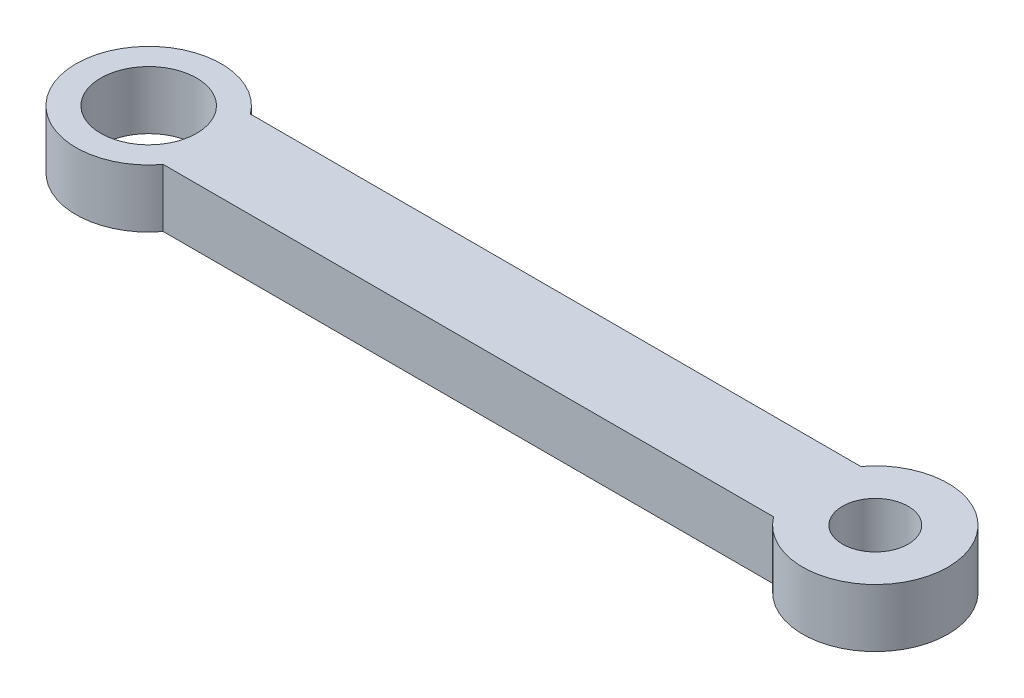
ISO-10303-21;
HEADER;
FILE_DESCRIPTION(('STEP AP214'),'2;1');
FILE_NAME('part.step','',(''),(''),'','','');
FILE_SCHEMA(('AUTOMOTIVE_DESIGN { 1 0 10303 214 1 1 1 1 }'));
ENDSEC;
DATA;
#1=APPLICATION_CONTEXT('core data for automotive mechanical design processes');
#2=APPLICATION_PROTOCOL_DEFINITION('international standard','automotive_design',2000,#1);
#3=PRODUCT_CONTEXT('',#1,'mechanical');
#4=PRODUCT('Part','Part','',(#3));
#5=PRODUCT_RELATED_PRODUCT_CATEGORY('part','',(#4));
#6=PRODUCT_DEFINITION_FORMATION('','',#4);
#7=PRODUCT_DEFINITION_CONTEXT('part definition',#1,'design');
#8=PRODUCT_DEFINITION('design','',#6,#7);
#9=PRODUCT_DEFINITION_SHAPE('','',#8);
#10=(LENGTH_UNIT() NAMED_UNIT(*) SI_UNIT(.MILLI.,.METRE.));
#11=(NAMED_UNIT(*) PLANE_ANGLE_UNIT() SI_UNIT($,.RADIAN.));
#12=(NAMED_UNIT(*) SI_UNIT($,.STERADIAN.) SOLID_ANGLE_UNIT());
#13=UNCERTAINTY_MEASURE_WITH_UNIT(LENGTH_MEASURE(1.E-05),#10,'distance_accuracy_value','');
#14=(GEOMETRIC_REPRESENTATION_CONTEXT(3) GLOBAL_UNCERTAINTY_ASSIGNED_CONTEXT((#13)) GLOBAL_UNIT_ASSIGNED_CONTEXT((#10,
#11,#12)) REPRESENTATION_CONTEXT('',''));
#15=CARTESIAN_POINT('',(0.,0.,0.));
#16=DIRECTION('',(0.,0.,1.));
#17=DIRECTION('',(1.,0.,0.));
#18=AXIS2_PLACEMENT_3D('',#15,#16,#17);
#19=CARTESIAN_POINT('',(-12.5,2.,0.));
#20=DIRECTION('',(0.,1.,0.));
#21=DIRECTION('',(0.,0.,1.));
#22=AXIS2_PLACEMENT_3D('',#19,#20,#21);
#23=PLANE('',#22);
#24=CARTESIAN_POINT('',(-12.5,2.,0.));
#25=DIRECTION('',(0.,1.,0.));
#26=DIRECTION('',(0.,0.,1.));
#27=AXIS2_PLACEMENT_3D('',#24,#25,#26);
#28=CIRCLE('',#27,1.65);
#29=CARTESIAN_POINT('',(-12.5,2.,1.65));
#30=VERTEX_POINT('',#29);
#31=EDGE_CURVE('E100',#30,#30,#28,.T.);
#32=ORIENTED_EDGE('',*,*,#31,.F.);
#33=EDGE_LOOP('',(#32));
#34=FACE_BOUND('',#33,.T.);
#35=CARTESIAN_POINT('',(-12.5,2.,0.));
#36=DIRECTION('',(0.,1.,0.));
#37=DIRECTION('',(0.,0.,1.));
#38=AXIS2_PLACEMENT_3D('',#35,#36,#37);
#39=CIRCLE('',#38,2.5);
#40=CARTESIAN_POINT('',(-10.5,2.,-1.5));
#41=VERTEX_POINT('',#40);
#42=CARTESIAN_POINT('',(-10.5,2.,1.5));
#43=VERTEX_POINT('',#42);
#44=EDGE_CURVE('E85',#41,#43,#39,.T.);
#45=ORIENTED_EDGE('',*,*,#44,.T.);
#46=DIRECTION('',(1.,0.,0.));
#47=VECTOR('',#46,1.);
#48=CARTESIAN_POINT('',(-10.5,2.,1.5));
#49=LINE('',#48,#47);
#50=CARTESIAN_POINT('',(10.5,2.,1.5));
#51=VERTEX_POINT('',#50);
#52=EDGE_CURVE('E80',#43,#51,#49,.T.);
#53=ORIENTED_EDGE('',*,*,#52,.T.);
#54=CARTESIAN_POINT('',(12.5,2.,0.));
#55=DIRECTION('',(0.,1.,0.));
#56=DIRECTION('',(0.,0.,-1.));
#57=AXIS2_PLACEMENT_3D('',#54,#55,#56);
#58=CIRCLE('',#57,2.5);
#59=CARTESIAN_POINT('',(10.5,2.,-1.5));
#60=VERTEX_POINT('',#59);
#61=EDGE_CURVE('E83',#51,#60,#58,.T.);
#62=ORIENTED_EDGE('',*,*,#61,.T.);
#63=DIRECTION('',(-1.,0.,0.));
#64=VECTOR('',#63,1.);
#65=CARTESIAN_POINT('',(-10.5,2.,-1.5));
#66=LINE('',#65,#64);
#67=EDGE_CURVE('E50',#60,#41,#66,.T.);
#68=ORIENTED_EDGE('',*,*,#67,.T.);
#69=EDGE_LOOP('',(#45,#53,#62,#68));
#70=FACE_BOUND('',#69,.T.);
#71=CARTESIAN_POINT('',(12.5,2.,0.));
#72=DIRECTION('',(0.,1.,0.));
#73=DIRECTION('',(0.,0.,1.));
#74=AXIS2_PLACEMENT_3D('',#71,#72,#73);
#75=CIRCLE('',#74,1.1303);
#76=CARTESIAN_POINT('',(12.5,2.,1.1303));
#77=VERTEX_POINT('',#76);
#78=EDGE_CURVE('E115',#77,#77,#75,.T.);
#79=ORIENTED_EDGE('',*,*,#78,.F.);
#80=EDGE_LOOP('',(#79));
#81=FACE_BOUND('',#80,.T.);
#82=ADVANCED_FACE('F33',(#34,#70,#81),#23,.T.);
#83=CARTESIAN_POINT('',(-12.5,0.,0.));
#84=DIRECTION('',(0.,1.,0.));
#85=DIRECTION('',(0.,0.,1.));
#86=AXIS2_PLACEMENT_3D('',#83,#84,#85);
#87=PLANE('',#86);
#88=CARTESIAN_POINT('',(-12.5,0.,0.));
#89=DIRECTION('',(0.,1.,0.));
#90=DIRECTION('',(0.,0.,1.));
#91=AXIS2_PLACEMENT_3D('',#88,#89,#90);
#92=CIRCLE('',#91,2.5);
#93=CARTESIAN_POINT('',(-10.5,0.,-1.5));
#94=VERTEX_POINT('',#93);
#95=CARTESIAN_POINT('',(-10.5,0.,1.5));
#96=VERTEX_POINT('',#95);
#97=EDGE_CURVE('E97',#94,#96,#92,.T.);
#98=ORIENTED_EDGE('',*,*,#97,.F.);
#99=DIRECTION('',(-1.,0.,0.));
#100=VECTOR('',#99,1.);
#101=CARTESIAN_POINT('',(-10.5,0.,-1.5));
#102=LINE('',#101,#100);
#103=CARTESIAN_POINT('',(10.5,0.,-1.5));
#104=VERTEX_POINT('',#103);
#105=EDGE_CURVE('E73',#104,#94,#102,.T.);
#106=ORIENTED_EDGE('',*,*,#105,.F.);
#107=CARTESIAN_POINT('',(12.5,0.,0.));
#108=DIRECTION('',(0.,1.,0.));
#109=DIRECTION('',(0.,0.,-1.));
#110=AXIS2_PLACEMENT_3D('',#107,#108,#109);
#111=CIRCLE('',#110,2.5);
#112=CARTESIAN_POINT('',(10.5,0.,1.5));
#113=VERTEX_POINT('',#112);
#114=EDGE_CURVE('E67',#113,#104,#111,.T.);
#115=ORIENTED_EDGE('',*,*,#114,.F.);
#116=DIRECTION('',(1.,0.,0.));
#117=VECTOR('',#116,1.);
#118=CARTESIAN_POINT('',(-10.5,0.,1.5));
#119=LINE('',#118,#117);
#120=EDGE_CURVE('E89',#96,#113,#119,.T.);
#121=ORIENTED_EDGE('',*,*,#120,.F.);
#122=EDGE_LOOP('',(#98,#106,#115,#121));
#123=FACE_BOUND('',#122,.T.);
#124=CARTESIAN_POINT('',(-12.5,0.,0.));
#125=DIRECTION('',(0.,1.,0.));
#126=DIRECTION('',(0.,0.,1.));
#127=AXIS2_PLACEMENT_3D('',#124,#125,#126);
#128=CIRCLE('',#127,1.65);
#129=CARTESIAN_POINT('',(-12.5,0.,1.65));
#130=VERTEX_POINT('',#129);
#131=EDGE_CURVE('E112',#130,#130,#128,.T.);
#132=ORIENTED_EDGE('',*,*,#131,.T.);
#133=EDGE_LOOP('',(#132));
#134=FACE_BOUND('',#133,.T.);
#135=CARTESIAN_POINT('',(12.5,0.,0.));
#136=DIRECTION('',(0.,1.,0.));
#137=DIRECTION('',(0.,0.,1.));
#138=AXIS2_PLACEMENT_3D('',#135,#136,#137);
#139=CIRCLE('',#138,1.1303);
#140=CARTESIAN_POINT('',(12.5,0.,1.1303));
#141=VERTEX_POINT('',#140);
#142=EDGE_CURVE('E118',#141,#141,#139,.T.);
#143=ORIENTED_EDGE('',*,*,#142,.T.);
#144=EDGE_LOOP('',(#143));
#145=FACE_BOUND('',#144,.T.);
#146=ADVANCED_FACE('F108',(#123,#134,#145),#87,.F.);
#147=CARTESIAN_POINT('',(-12.5,2.,0.));
#148=DIRECTION('',(0.,-1.,0.));
#149=DIRECTION('',(0.,0.,-1.));
#150=AXIS2_PLACEMENT_3D('',#147,#148,#149);
#151=CYLINDRICAL_SURFACE('',#150,2.5);
#152=ORIENTED_EDGE('',*,*,#97,.T.);
#153=DIRECTION('',(0.,-1.,0.));
#154=VECTOR('',#153,1.);
#155=CARTESIAN_POINT('',(-10.5,2.,1.5));
#156=LINE('',#155,#154);
#157=EDGE_CURVE('E11',#43,#96,#156,.T.);
#158=ORIENTED_EDGE('',*,*,#157,.F.);
#159=ORIENTED_EDGE('',*,*,#44,.F.);
#160=DIRECTION('',(0.,-1.,0.));
#161=VECTOR('',#160,1.);
#162=CARTESIAN_POINT('',(-10.5,2.,-1.5));
#163=LINE('',#162,#161);
#164=EDGE_CURVE('E93',#41,#94,#163,.T.);
#165=ORIENTED_EDGE('',*,*,#164,.T.);
#166=EDGE_LOOP('',(#152,#158,#159,#165));
#167=FACE_BOUND('',#166,.T.);
#168=ADVANCED_FACE('F35',(#167),#151,.T.);
#169=CARTESIAN_POINT('',(-10.5,2.,1.5));
#170=DIRECTION('',(0.,0.,-1.));
#171=DIRECTION('',(-1.,0.,0.));
#172=AXIS2_PLACEMENT_3D('',#169,#170,#171);
#173=PLANE('',#172);
#174=ORIENTED_EDGE('',*,*,#120,.T.);
#175=DIRECTION('',(0.,-1.,0.));
#176=VECTOR('',#175,1.);
#177=CARTESIAN_POINT('',(10.5,2.,1.5));
#178=LINE('',#177,#176);
#179=EDGE_CURVE('E42',#51,#113,#178,.T.);
#180=ORIENTED_EDGE('',*,*,#179,.F.);
#181=ORIENTED_EDGE('',*,*,#52,.F.);
#182=ORIENTED_EDGE('',*,*,#157,.T.);
#183=EDGE_LOOP('',(#174,#180,#181,#182));
#184=FACE_BOUND('',#183,.T.);
#185=ADVANCED_FACE('F88',(#184),#173,.F.);
#186=CARTESIAN_POINT('',(12.5,2.,0.));
#187=DIRECTION('',(0.,-1.,0.));
#188=DIRECTION('',(0.,0.,-1.));
#189=AXIS2_PLACEMENT_3D('',#186,#187,#188);
#190=CYLINDRICAL_SURFACE('',#189,2.5);
#191=ORIENTED_EDGE('',*,*,#114,.T.);
#192=DIRECTION('',(0.,-1.,0.));
#193=VECTOR('',#192,1.);
#194=CARTESIAN_POINT('',(10.5,2.,-1.5));
#195=LINE('',#194,#193);
#196=EDGE_CURVE('E90',#60,#104,#195,.T.);
#197=ORIENTED_EDGE('',*,*,#196,.F.);
#198=ORIENTED_EDGE('',*,*,#61,.F.);
#199=ORIENTED_EDGE('',*,*,#179,.T.);
#200=EDGE_LOOP('',(#191,#197,#198,#199));
#201=FACE_BOUND('',#200,.T.);
#202=ADVANCED_FACE('F91',(#201),#190,.T.);
#203=CARTESIAN_POINT('',(-10.5,2.,-1.5));
#204=DIRECTION('',(0.,0.,1.));
#205=DIRECTION('',(1.,0.,0.));
#206=AXIS2_PLACEMENT_3D('',#203,#204,#205);
#207=PLANE('',#206);
#208=ORIENTED_EDGE('',*,*,#105,.T.);
#209=ORIENTED_EDGE('',*,*,#164,.F.);
#210=ORIENTED_EDGE('',*,*,#67,.F.);
#211=ORIENTED_EDGE('',*,*,#196,.T.);
#212=EDGE_LOOP('',(#208,#209,#210,#211));
#213=FACE_BOUND('',#212,.T.);
#214=ADVANCED_FACE('F105',(#213),#207,.F.);
#215=CARTESIAN_POINT('',(-12.5,2.,0.));
#216=DIRECTION('',(0.,-1.,0.));
#217=DIRECTION('',(0.,0.,-1.));
#218=AXIS2_PLACEMENT_3D('',#215,#216,#217);
#219=CYLINDRICAL_SURFACE('',#218,1.65);
#220=ORIENTED_EDGE('',*,*,#31,.T.);
#221=EDGE_LOOP('',(#220));
#222=FACE_BOUND('',#221,.T.);
#223=ORIENTED_EDGE('',*,*,#131,.F.);
#224=EDGE_LOOP('',(#223));
#225=FACE_BOUND('',#224,.T.);
#226=ADVANCED_FACE('F135',(#222,#225),#219,.F.);
#227=CARTESIAN_POINT('',(12.5,2.,0.));
#228=DIRECTION('',(0.,-1.,0.));
#229=DIRECTION('',(0.,0.,-1.));
#230=AXIS2_PLACEMENT_3D('',#227,#228,#229);
#231=CYLINDRICAL_SURFACE('',#230,1.1303);
#232=ORIENTED_EDGE('',*,*,#78,.T.);
#233=EDGE_LOOP('',(#232));
#234=FACE_BOUND('',#233,.T.);
#235=ORIENTED_EDGE('',*,*,#142,.F.);
#236=EDGE_LOOP('',(#235));
#237=FACE_BOUND('',#236,.T.);
#238=ADVANCED_FACE('F124',(#234,#237),#231,.F.);
#239=CLOSED_SHELL('',(#82,#146,#168,#185,#202,#214,#226,#238));
#240=MANIFOLD_SOLID_BREP('B2',#239);
#241=ADVANCED_BREP_SHAPE_REPRESENTATION('',(#18,#240),#14);
#242=SHAPE_DEFINITION_REPRESENTATION(#9,#241);
ENDSEC;
END-ISO-10303-21;
